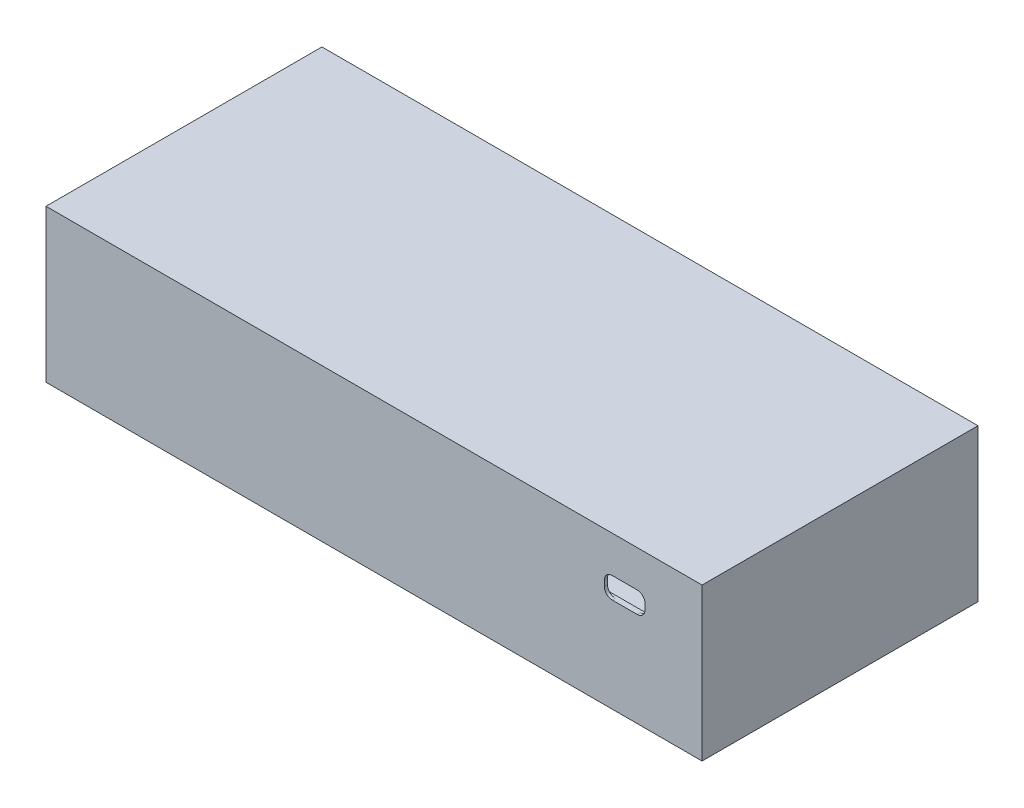
ISO-10303-21;
HEADER;
FILE_DESCRIPTION(('STEP AP214'),'2;1');
FILE_NAME('part.step','',(''),(''),'','','');
FILE_SCHEMA(('AUTOMOTIVE_DESIGN { 1 0 10303 214 1 1 1 1 }'));
ENDSEC;
DATA;
#1=APPLICATION_CONTEXT('core data for automotive mechanical design processes');
#2=APPLICATION_PROTOCOL_DEFINITION('international standard','automotive_design',2000,#1);
#3=PRODUCT_CONTEXT('',#1,'mechanical');
#4=PRODUCT('Part','Part','',(#3));
#5=PRODUCT_RELATED_PRODUCT_CATEGORY('part','',(#4));
#6=PRODUCT_DEFINITION_FORMATION('','',#4);
#7=PRODUCT_DEFINITION_CONTEXT('part definition',#1,'design');
#8=PRODUCT_DEFINITION('design','',#6,#7);
#9=PRODUCT_DEFINITION_SHAPE('','',#8);
#10=(LENGTH_UNIT() NAMED_UNIT(*) SI_UNIT(.MILLI.,.METRE.));
#11=(NAMED_UNIT(*) PLANE_ANGLE_UNIT() SI_UNIT($,.RADIAN.));
#12=(NAMED_UNIT(*) SI_UNIT($,.STERADIAN.) SOLID_ANGLE_UNIT());
#13=UNCERTAINTY_MEASURE_WITH_UNIT(LENGTH_MEASURE(1.E-05),#10,'distance_accuracy_value','');
#14=(GEOMETRIC_REPRESENTATION_CONTEXT(3) GLOBAL_UNCERTAINTY_ASSIGNED_CONTEXT((#13)) GLOBAL_UNIT_ASSIGNED_CONTEXT((#10,
#11,#12)) REPRESENTATION_CONTEXT('',''));
#15=CARTESIAN_POINT('',(0.,0.,0.));
#16=DIRECTION('',(0.,0.,1.));
#17=DIRECTION('',(1.,0.,0.));
#18=AXIS2_PLACEMENT_3D('',#15,#16,#17);
#19=CARTESIAN_POINT('',(25.,39.5,34.25));
#20=DIRECTION('',(0.,0.,1.));
#21=DIRECTION('',(1.,0.,0.));
#22=AXIS2_PLACEMENT_3D('',#19,#20,#21);
#23=PLANE('',#22);
#24=DIRECTION('',(0.,-1.,0.));
#25=VECTOR('',#24,1.);
#26=CARTESIAN_POINT('',(23.2,39.5,34.25));
#27=LINE('',#26,#25);
#28=CARTESIAN_POINT('',(23.2,37.,34.25));
#29=VERTEX_POINT('',#28);
#30=CARTESIAN_POINT('',(23.2,30.5,34.25));
#31=VERTEX_POINT('',#30);
#32=EDGE_CURVE('E236',#29,#31,#27,.T.);
#33=ORIENTED_EDGE('',*,*,#32,.T.);
#34=DIRECTION('',(-1.,0.,0.));
#35=VECTOR('',#34,1.);
#36=CARTESIAN_POINT('',(25.,30.5,34.25));
#37=LINE('',#36,#35);
#38=CARTESIAN_POINT('',(-145.,30.5,34.25));
#39=VERTEX_POINT('',#38);
#40=EDGE_CURVE('E55',#31,#39,#37,.T.);
#41=ORIENTED_EDGE('',*,*,#40,.T.);
#42=DIRECTION('',(0.,-1.,0.));
#43=VECTOR('',#42,1.);
#44=CARTESIAN_POINT('',(-145.,39.5,34.25));
#45=LINE('',#44,#43);
#46=CARTESIAN_POINT('',(-145.,37.,34.25));
#47=VERTEX_POINT('',#46);
#48=EDGE_CURVE('E253',#47,#39,#45,.T.);
#49=ORIENTED_EDGE('',*,*,#48,.F.);
#50=DIRECTION('',(1.,0.,0.));
#51=VECTOR('',#50,1.);
#52=CARTESIAN_POINT('',(-213.545605256646,37.,34.25));
#53=LINE('',#52,#51);
#54=EDGE_CURVE('E212',#47,#29,#53,.T.);
#55=ORIENTED_EDGE('',*,*,#54,.T.);
#56=EDGE_LOOP('',(#33,#41,#49,#55));
#57=FACE_BOUND('',#56,.T.);
#58=ADVANCED_FACE('F39',(#57),#23,.F.);
#59=CARTESIAN_POINT('',(25.,39.5,-34.2499999999999));
#60=DIRECTION('',(0.,0.,-1.));
#61=DIRECTION('',(-1.,0.,0.));
#62=AXIS2_PLACEMENT_3D('',#59,#60,#61);
#63=PLANE('',#62);
#64=DIRECTION('',(1.,0.,0.));
#65=VECTOR('',#64,1.);
#66=CARTESIAN_POINT('',(-213.545605256646,37.,-34.25));
#67=LINE('',#66,#65);
#68=CARTESIAN_POINT('',(-145.,37.,-34.25));
#69=VERTEX_POINT('',#68);
#70=CARTESIAN_POINT('',(23.2,37.,-34.2500000000001));
#71=VERTEX_POINT('',#70);
#72=EDGE_CURVE('E209',#69,#71,#67,.T.);
#73=ORIENTED_EDGE('',*,*,#72,.F.);
#74=DIRECTION('',(0.,-1.,0.));
#75=VECTOR('',#74,1.);
#76=CARTESIAN_POINT('',(-145.,39.5,-34.25));
#77=LINE('',#76,#75);
#78=CARTESIAN_POINT('',(-145.,2.,-34.25));
#79=VERTEX_POINT('',#78);
#80=EDGE_CURVE('E221',#69,#79,#77,.T.);
#81=ORIENTED_EDGE('',*,*,#80,.T.);
#82=DIRECTION('',(1.,0.,0.));
#83=VECTOR('',#82,1.);
#84=CARTESIAN_POINT('',(25.,2.,-34.2499999999999));
#85=LINE('',#84,#83);
#86=CARTESIAN_POINT('',(23.2,2.,-34.25));
#87=VERTEX_POINT('',#86);
#88=EDGE_CURVE('E234',#79,#87,#85,.T.);
#89=ORIENTED_EDGE('',*,*,#88,.T.);
#90=DIRECTION('',(0.,-1.,0.));
#91=VECTOR('',#90,1.);
#92=CARTESIAN_POINT('',(23.2,39.5,-34.25));
#93=LINE('',#92,#91);
#94=EDGE_CURVE('E223',#71,#87,#93,.T.);
#95=ORIENTED_EDGE('',*,*,#94,.F.);
#96=EDGE_LOOP('',(#73,#81,#89,#95));
#97=FACE_BOUND('',#96,.T.);
#98=ADVANCED_FACE('F219',(#97),#63,.F.);
#99=CARTESIAN_POINT('',(23.2,39.5,34.25));
#100=DIRECTION('',(1.,0.,0.));
#101=DIRECTION('',(0.,0.,-1.));
#102=AXIS2_PLACEMENT_3D('',#99,#100,#101);
#103=PLANE('',#102);
#104=DIRECTION('',(0.,0.,1.));
#105=VECTOR('',#104,1.);
#106=CARTESIAN_POINT('',(23.2,37.,-34.2500000000001));
#107=LINE('',#106,#105);
#108=EDGE_CURVE('E224',#71,#29,#107,.T.);
#109=ORIENTED_EDGE('',*,*,#108,.F.);
#110=ORIENTED_EDGE('',*,*,#94,.T.);
#111=DIRECTION('',(0.,0.,1.));
#112=VECTOR('',#111,1.);
#113=CARTESIAN_POINT('',(23.2,2.,34.25));
#114=LINE('',#113,#112);
#115=CARTESIAN_POINT('',(23.2,2.,34.25));
#116=VERTEX_POINT('',#115);
#117=EDGE_CURVE('E416',#87,#116,#114,.T.);
#118=ORIENTED_EDGE('',*,*,#117,.T.);
#119=CARTESIAN_POINT('',(23.2,24.5,34.25));
#120=VERTEX_POINT('',#119);
#121=EDGE_CURVE('E420',#120,#116,#27,.T.);
#122=ORIENTED_EDGE('',*,*,#121,.F.);
#123=DIRECTION('',(0.,0.,-1.));
#124=VECTOR('',#123,1.);
#125=CARTESIAN_POINT('',(23.2,24.5,34.95));
#126=LINE('',#125,#124);
#127=CARTESIAN_POINT('',(23.2,24.5,34.95));
#128=VERTEX_POINT('',#127);
#129=EDGE_CURVE('E417',#128,#120,#126,.T.);
#130=ORIENTED_EDGE('',*,*,#129,.F.);
#131=DIRECTION('',(0.,-1.,0.));
#132=VECTOR('',#131,1.);
#133=CARTESIAN_POINT('',(23.2,30.,34.95));
#134=LINE('',#133,#132);
#135=CARTESIAN_POINT('',(23.2,30.,34.95));
#136=VERTEX_POINT('',#135);
#137=EDGE_CURVE('E451',#136,#128,#134,.T.);
#138=ORIENTED_EDGE('',*,*,#137,.F.);
#139=DIRECTION('',(0.,0.,-1.));
#140=VECTOR('',#139,1.);
#141=CARTESIAN_POINT('',(23.2,30.,34.95));
#142=LINE('',#141,#140);
#143=CARTESIAN_POINT('',(23.2,30.,34.75));
#144=VERTEX_POINT('',#143);
#145=EDGE_CURVE('E372',#136,#144,#142,.T.);
#146=ORIENTED_EDGE('',*,*,#145,.T.);
#147=DIRECTION('',(0.,-0.707106781186548,0.707106781186547));
#148=VECTOR('',#147,1.);
#149=CARTESIAN_POINT('',(23.2,35.,29.75));
#150=LINE('',#149,#148);
#151=EDGE_CURVE('E11',#144,#31,#150,.F.);
#152=ORIENTED_EDGE('',*,*,#151,.T.);
#153=ORIENTED_EDGE('',*,*,#32,.F.);
#154=EDGE_LOOP('',(#109,#110,#118,#122,#130,#138,#146,#152,#153));
#155=FACE_BOUND('',#154,.T.);
#156=ADVANCED_FACE('F387',(#155),#103,.F.);
#157=CARTESIAN_POINT('',(-25.,2.,35.75));
#158=DIRECTION('',(0.,0.,-1.));
#159=DIRECTION('',(-1.,0.,0.));
#160=AXIS2_PLACEMENT_3D('',#157,#158,#159);
#161=PLANE('',#160);
#162=DIRECTION('',(1.,0.,0.));
#163=VECTOR('',#162,1.);
#164=CARTESIAN_POINT('',(-25.,0.,35.75));
#165=LINE('',#164,#163);
#166=CARTESIAN_POINT('',(-145.,0.,35.75));
#167=VERTEX_POINT('',#166);
#168=CARTESIAN_POINT('',(25.,0.,35.75));
#169=VERTEX_POINT('',#168);
#170=EDGE_CURVE('E298',#167,#169,#165,.T.);
#171=ORIENTED_EDGE('',*,*,#170,.T.);
#172=DIRECTION('',(0.,-1.,0.));
#173=VECTOR('',#172,1.);
#174=CARTESIAN_POINT('',(25.,2.,35.75));
#175=LINE('',#174,#173);
#176=CARTESIAN_POINT('',(25.,39.5,35.75));
#177=VERTEX_POINT('',#176);
#178=EDGE_CURVE('E300',#177,#169,#175,.T.);
#179=ORIENTED_EDGE('',*,*,#178,.F.);
#180=DIRECTION('',(1.,0.,0.));
#181=VECTOR('',#180,1.);
#182=CARTESIAN_POINT('',(25.,39.5,35.75));
#183=LINE('',#182,#181);
#184=CARTESIAN_POINT('',(-145.,39.5,35.75));
#185=VERTEX_POINT('',#184);
#186=EDGE_CURVE('E247',#185,#177,#183,.T.);
#187=ORIENTED_EDGE('',*,*,#186,.F.);
#188=DIRECTION('',(0.,-1.,0.));
#189=VECTOR('',#188,1.);
#190=CARTESIAN_POINT('',(-145.,2.,35.75));
#191=LINE('',#190,#189);
#192=EDGE_CURVE('E257',#185,#167,#191,.T.);
#193=ORIENTED_EDGE('',*,*,#192,.T.);
#194=EDGE_LOOP('',(#171,#179,#187,#193));
#195=FACE_BOUND('',#194,.T.);
#196=DIRECTION('',(0.,1.,0.));
#197=VECTOR('',#196,1.);
#198=CARTESIAN_POINT('',(10.2,2.,35.75));
#199=LINE('',#198,#197);
#200=CARTESIAN_POINT('',(10.2,26.5,35.75));
#201=VERTEX_POINT('',#200);
#202=CARTESIAN_POINT('',(10.2,28.,35.75));
#203=VERTEX_POINT('',#202);
#204=EDGE_CURVE('E445',#201,#203,#199,.T.);
#205=ORIENTED_EDGE('',*,*,#204,.F.);
#206=CARTESIAN_POINT('',(8.20000000000001,26.5,35.75));
#207=DIRECTION('',(0.,0.,-1.));
#208=DIRECTION('',(-1.,0.,0.));
#209=AXIS2_PLACEMENT_3D('',#206,#207,#208);
#210=CIRCLE('',#209,2.);
#211=CARTESIAN_POINT('',(8.20000000000001,24.5,35.75));
#212=VERTEX_POINT('',#211);
#213=EDGE_CURVE('E341',#201,#212,#210,.T.);
#214=ORIENTED_EDGE('',*,*,#213,.T.);
#215=DIRECTION('',(-1.,0.,0.));
#216=VECTOR('',#215,1.);
#217=CARTESIAN_POINT('',(-25.,24.5,35.75));
#218=LINE('',#217,#216);
#219=CARTESIAN_POINT('',(1.70000000000001,24.5,35.75));
#220=VERTEX_POINT('',#219);
#221=EDGE_CURVE('E436',#212,#220,#218,.T.);
#222=ORIENTED_EDGE('',*,*,#221,.T.);
#223=CARTESIAN_POINT('',(1.70000000000001,26.5,35.75));
#224=DIRECTION('',(0.,0.,-1.));
#225=DIRECTION('',(-1.,0.,0.));
#226=AXIS2_PLACEMENT_3D('',#223,#224,#225);
#227=CIRCLE('',#226,2.);
#228=CARTESIAN_POINT('',(-0.299999999999991,26.5,35.75));
#229=VERTEX_POINT('',#228);
#230=EDGE_CURVE('E355',#220,#229,#227,.T.);
#231=ORIENTED_EDGE('',*,*,#230,.T.);
#232=DIRECTION('',(0.,1.,0.));
#233=VECTOR('',#232,1.);
#234=CARTESIAN_POINT('',(-0.299999999999991,2.,35.75));
#235=LINE('',#234,#233);
#236=CARTESIAN_POINT('',(-0.299999999999991,28.,35.75));
#237=VERTEX_POINT('',#236);
#238=EDGE_CURVE('E439',#229,#237,#235,.T.);
#239=ORIENTED_EDGE('',*,*,#238,.T.);
#240=CARTESIAN_POINT('',(1.70000000000001,28.,35.75));
#241=DIRECTION('',(0.,0.,-1.));
#242=DIRECTION('',(-1.,0.,0.));
#243=AXIS2_PLACEMENT_3D('',#240,#241,#242);
#244=CIRCLE('',#243,2.);
#245=CARTESIAN_POINT('',(1.70000000000001,30.,35.75));
#246=VERTEX_POINT('',#245);
#247=EDGE_CURVE('E350',#237,#246,#244,.T.);
#248=ORIENTED_EDGE('',*,*,#247,.T.);
#249=DIRECTION('',(1.,0.,0.));
#250=VECTOR('',#249,1.);
#251=CARTESIAN_POINT('',(-25.,30.,35.75));
#252=LINE('',#251,#250);
#253=CARTESIAN_POINT('',(8.20000000000001,30.,35.75));
#254=VERTEX_POINT('',#253);
#255=EDGE_CURVE('E442',#246,#254,#252,.T.);
#256=ORIENTED_EDGE('',*,*,#255,.T.);
#257=CARTESIAN_POINT('',(8.20000000000001,28.,35.75));
#258=DIRECTION('',(0.,0.,-1.));
#259=DIRECTION('',(-1.,0.,0.));
#260=AXIS2_PLACEMENT_3D('',#257,#258,#259);
#261=CIRCLE('',#260,2.);
#262=EDGE_CURVE('E346',#254,#203,#261,.T.);
#263=ORIENTED_EDGE('',*,*,#262,.T.);
#264=EDGE_LOOP('',(#205,#214,#222,#231,#239,#248,#256,#263));
#265=FACE_BOUND('',#264,.T.);
#266=ADVANCED_FACE('F402',(#195,#265),#161,.F.);
#267=CARTESIAN_POINT('',(0.,0.,34.95));
#268=DIRECTION('',(0.,0.,1.));
#269=DIRECTION('',(1.,0.,0.));
#270=AXIS2_PLACEMENT_3D('',#267,#268,#269);
#271=PLANE('',#270);
#272=DIRECTION('',(-1.,0.,0.));
#273=VECTOR('',#272,1.);
#274=CARTESIAN_POINT('',(-145.,24.5000000000001,34.95));
#275=LINE('',#274,#273);
#276=CARTESIAN_POINT('',(8.19999999999996,24.5,34.95));
#277=VERTEX_POINT('',#276);
#278=EDGE_CURVE('E373',#128,#277,#275,.T.);
#279=ORIENTED_EDGE('',*,*,#278,.T.);
#280=CARTESIAN_POINT('',(8.20000000000001,26.5,34.95));
#281=DIRECTION('',(0.,0.,1.));
#282=DIRECTION('',(1.,0.,0.));
#283=AXIS2_PLACEMENT_3D('',#280,#281,#282);
#284=CIRCLE('',#283,2.);
#285=CARTESIAN_POINT('',(10.2,26.5,34.95));
#286=VERTEX_POINT('',#285);
#287=EDGE_CURVE('E339',#277,#286,#284,.T.);
#288=ORIENTED_EDGE('',*,*,#287,.T.);
#289=DIRECTION('',(0.,1.,0.));
#290=VECTOR('',#289,1.);
#291=CARTESIAN_POINT('',(10.2,0.,34.95));
#292=LINE('',#291,#290);
#293=CARTESIAN_POINT('',(10.2,28.,34.95));
#294=VERTEX_POINT('',#293);
#295=EDGE_CURVE('E215',#286,#294,#292,.T.);
#296=ORIENTED_EDGE('',*,*,#295,.T.);
#297=CARTESIAN_POINT('',(8.20000000000001,28.,34.95));
#298=DIRECTION('',(0.,0.,1.));
#299=DIRECTION('',(1.,0.,0.));
#300=AXIS2_PLACEMENT_3D('',#297,#298,#299);
#301=CIRCLE('',#300,2.);
#302=CARTESIAN_POINT('',(8.20000000000001,30.,34.95));
#303=VERTEX_POINT('',#302);
#304=EDGE_CURVE('E343',#294,#303,#301,.T.);
#305=ORIENTED_EDGE('',*,*,#304,.T.);
#306=DIRECTION('',(1.,0.,0.));
#307=VECTOR('',#306,1.);
#308=CARTESIAN_POINT('',(23.2,30.,34.95));
#309=LINE('',#308,#307);
#310=EDGE_CURVE('E449',#303,#136,#309,.T.);
#311=ORIENTED_EDGE('',*,*,#310,.T.);
#312=ORIENTED_EDGE('',*,*,#137,.T.);
#313=EDGE_LOOP('',(#279,#288,#296,#305,#311,#312));
#314=FACE_BOUND('',#313,.T.);
#315=ADVANCED_FACE('F393',(#314),#271,.F.);
#316=CARTESIAN_POINT('',(-145.,24.5000000000001,34.25));
#317=VERTEX_POINT('',#316);
#318=CARTESIAN_POINT('',(-145.,2.,34.25));
#319=VERTEX_POINT('',#318);
#320=EDGE_CURVE('E250',#317,#319,#45,.T.);
#321=ORIENTED_EDGE('',*,*,#320,.F.);
#322=DIRECTION('',(-1.,0.,0.));
#323=VECTOR('',#322,1.);
#324=CARTESIAN_POINT('',(-145.,24.5000000000001,34.25));
#325=LINE('',#324,#323);
#326=EDGE_CURVE('E408',#120,#317,#325,.T.);
#327=ORIENTED_EDGE('',*,*,#326,.F.);
#328=ORIENTED_EDGE('',*,*,#121,.T.);
#329=DIRECTION('',(-1.,0.,0.));
#330=VECTOR('',#329,1.);
#331=CARTESIAN_POINT('',(25.,2.,34.25));
#332=LINE('',#331,#330);
#333=EDGE_CURVE('E240',#116,#319,#332,.T.);
#334=ORIENTED_EDGE('',*,*,#333,.T.);
#335=EDGE_LOOP('',(#321,#327,#328,#334));
#336=FACE_BOUND('',#335,.T.);
#337=ADVANCED_FACE('F383',(#336),#23,.F.);
#338=CARTESIAN_POINT('',(0.,2.,0.));
#339=DIRECTION('',(0.,-1.,0.));
#340=DIRECTION('',(0.,0.,-1.));
#341=AXIS2_PLACEMENT_3D('',#338,#339,#340);
#342=PLANE('',#341);
#343=CARTESIAN_POINT('',(-13.9,2.,0.));
#344=DIRECTION('',(0.,1.,0.));
#345=DIRECTION('',(0.,0.,1.));
#346=AXIS2_PLACEMENT_3D('',#343,#344,#345);
#347=CIRCLE('',#346,1.25);
#348=CARTESIAN_POINT('',(-13.9,2.,1.24999999999999));
#349=VERTEX_POINT('',#348);
#350=EDGE_CURVE('E266',#349,#349,#347,.T.);
#351=ORIENTED_EDGE('',*,*,#350,.F.);
#352=EDGE_LOOP('',(#351));
#353=FACE_BOUND('',#352,.T.);
#354=CARTESIAN_POINT('',(13.9,2.,0.));
#355=DIRECTION('',(0.,1.,0.));
#356=DIRECTION('',(0.,0.,1.));
#357=AXIS2_PLACEMENT_3D('',#354,#355,#356);
#358=CIRCLE('',#357,1.25);
#359=CARTESIAN_POINT('',(13.9,2.,1.24999999999999));
#360=VERTEX_POINT('',#359);
#361=EDGE_CURVE('E263',#360,#360,#358,.F.);
#362=ORIENTED_EDGE('',*,*,#361,.T.);
#363=EDGE_LOOP('',(#362));
#364=FACE_BOUND('',#363,.T.);
#365=DIRECTION('',(-1.,0.,0.));
#366=VECTOR('',#365,1.);
#367=CARTESIAN_POINT('',(-11.5,2.,-6.25));
#368=LINE('',#367,#366);
#369=CARTESIAN_POINT('',(11.5,2.,-6.25));
#370=VERTEX_POINT('',#369);
#371=CARTESIAN_POINT('',(-11.5,2.,-6.25));
#372=VERTEX_POINT('',#371);
#373=EDGE_CURVE('E274',#370,#372,#368,.T.);
#374=ORIENTED_EDGE('',*,*,#373,.F.);
#375=DIRECTION('',(0.,0.,-1.));
#376=VECTOR('',#375,1.);
#377=CARTESIAN_POINT('',(11.5,2.,6.25));
#378=LINE('',#377,#376);
#379=CARTESIAN_POINT('',(11.5,2.,6.25));
#380=VERTEX_POINT('',#379);
#381=EDGE_CURVE('E272',#380,#370,#378,.T.);
#382=ORIENTED_EDGE('',*,*,#381,.F.);
#383=DIRECTION('',(1.,0.,0.));
#384=VECTOR('',#383,1.);
#385=CARTESIAN_POINT('',(-11.5,2.,6.25));
#386=LINE('',#385,#384);
#387=CARTESIAN_POINT('',(-11.5,2.,6.25));
#388=VERTEX_POINT('',#387);
#389=EDGE_CURVE('E281',#388,#380,#386,.T.);
#390=ORIENTED_EDGE('',*,*,#389,.F.);
#391=DIRECTION('',(0.,0.,1.));
#392=VECTOR('',#391,1.);
#393=CARTESIAN_POINT('',(-11.5,2.,6.25));
#394=LINE('',#393,#392);
#395=EDGE_CURVE('E278',#372,#388,#394,.T.);
#396=ORIENTED_EDGE('',*,*,#395,.F.);
#397=EDGE_LOOP('',(#374,#382,#390,#396));
#398=FACE_BOUND('',#397,.T.);
#399=ORIENTED_EDGE('',*,*,#117,.F.);
#400=ORIENTED_EDGE('',*,*,#88,.F.);
#401=DIRECTION('',(0.,0.,-1.));
#402=VECTOR('',#401,1.);
#403=CARTESIAN_POINT('',(-145.,2.,35.75));
#404=LINE('',#403,#402);
#405=EDGE_CURVE('E230',#319,#79,#404,.T.);
#406=ORIENTED_EDGE('',*,*,#405,.F.);
#407=ORIENTED_EDGE('',*,*,#333,.F.);
#408=EDGE_LOOP('',(#399,#400,#406,#407));
#409=FACE_BOUND('',#408,.T.);
#410=ADVANCED_FACE('F392',(#353,#364,#398,#409),#342,.F.);
#411=CARTESIAN_POINT('',(0.,0.,0.));
#412=DIRECTION('',(0.,-1.,0.));
#413=DIRECTION('',(0.,0.,-1.));
#414=AXIS2_PLACEMENT_3D('',#411,#412,#413);
#415=PLANE('',#414);
#416=CARTESIAN_POINT('',(13.9,0.,0.));
#417=DIRECTION('',(0.,-1.,0.));
#418=DIRECTION('',(0.,0.,-1.));
#419=AXIS2_PLACEMENT_3D('',#416,#417,#418);
#420=CIRCLE('',#419,1.25);
#421=CARTESIAN_POINT('',(13.9,0.,-1.25));
#422=VERTEX_POINT('',#421);
#423=EDGE_CURVE('E269',#422,#422,#420,.F.);
#424=ORIENTED_EDGE('',*,*,#423,.T.);
#425=EDGE_LOOP('',(#424));
#426=FACE_BOUND('',#425,.T.);
#427=DIRECTION('',(0.,0.,1.));
#428=VECTOR('',#427,1.);
#429=CARTESIAN_POINT('',(11.5,0.,0.));
#430=LINE('',#429,#428);
#431=CARTESIAN_POINT('',(11.5,0.,-6.25));
#432=VERTEX_POINT('',#431);
#433=CARTESIAN_POINT('',(11.5,0.,6.25));
#434=VERTEX_POINT('',#433);
#435=EDGE_CURVE('E313',#432,#434,#430,.T.);
#436=ORIENTED_EDGE('',*,*,#435,.F.);
#437=DIRECTION('',(1.,0.,0.));
#438=VECTOR('',#437,1.);
#439=CARTESIAN_POINT('',(0.,0.,-6.25));
#440=LINE('',#439,#438);
#441=CARTESIAN_POINT('',(-11.5,0.,-6.25));
#442=VERTEX_POINT('',#441);
#443=EDGE_CURVE('E306',#442,#432,#440,.T.);
#444=ORIENTED_EDGE('',*,*,#443,.F.);
#445=DIRECTION('',(0.,0.,-1.));
#446=VECTOR('',#445,1.);
#447=CARTESIAN_POINT('',(-11.5,0.,0.));
#448=LINE('',#447,#446);
#449=CARTESIAN_POINT('',(-11.5,0.,6.25));
#450=VERTEX_POINT('',#449);
#451=EDGE_CURVE('E308',#450,#442,#448,.T.);
#452=ORIENTED_EDGE('',*,*,#451,.F.);
#453=DIRECTION('',(-1.,0.,0.));
#454=VECTOR('',#453,1.);
#455=CARTESIAN_POINT('',(0.,0.,6.25));
#456=LINE('',#455,#454);
#457=EDGE_CURVE('E311',#434,#450,#456,.T.);
#458=ORIENTED_EDGE('',*,*,#457,.F.);
#459=EDGE_LOOP('',(#436,#444,#452,#458));
#460=FACE_BOUND('',#459,.T.);
#461=DIRECTION('',(0.,0.,-1.));
#462=VECTOR('',#461,1.);
#463=CARTESIAN_POINT('',(25.,0.,35.75));
#464=LINE('',#463,#462);
#465=CARTESIAN_POINT('',(25.,0.,-35.75));
#466=VERTEX_POINT('',#465);
#467=EDGE_CURVE('E287',#169,#466,#464,.T.);
#468=ORIENTED_EDGE('',*,*,#467,.F.);
#469=ORIENTED_EDGE('',*,*,#170,.F.);
#470=DIRECTION('',(0.,0.,-1.));
#471=VECTOR('',#470,1.);
#472=CARTESIAN_POINT('',(-145.,0.,35.75));
#473=LINE('',#472,#471);
#474=CARTESIAN_POINT('',(-145.,0.,-35.75));
#475=VERTEX_POINT('',#474);
#476=EDGE_CURVE('E255',#167,#475,#473,.T.);
#477=ORIENTED_EDGE('',*,*,#476,.T.);
#478=DIRECTION('',(-1.,0.,0.));
#479=VECTOR('',#478,1.);
#480=CARTESIAN_POINT('',(-25.,0.,-35.75));
#481=LINE('',#480,#479);
#482=EDGE_CURVE('E296',#466,#475,#481,.T.);
#483=ORIENTED_EDGE('',*,*,#482,.F.);
#484=EDGE_LOOP('',(#468,#469,#477,#483));
#485=FACE_BOUND('',#484,.T.);
#486=CARTESIAN_POINT('',(-13.9,0.,0.));
#487=DIRECTION('',(0.,-1.,0.));
#488=DIRECTION('',(0.,0.,-1.));
#489=AXIS2_PLACEMENT_3D('',#486,#487,#488);
#490=CIRCLE('',#489,1.25);
#491=CARTESIAN_POINT('',(-13.9,0.,-1.25));
#492=VERTEX_POINT('',#491);
#493=EDGE_CURVE('E275',#492,#492,#490,.T.);
#494=ORIENTED_EDGE('',*,*,#493,.F.);
#495=EDGE_LOOP('',(#494));
#496=FACE_BOUND('',#495,.T.);
#497=ADVANCED_FACE('F399',(#426,#460,#485,#496),#415,.T.);
#498=CARTESIAN_POINT('',(25.,2.,35.75));
#499=DIRECTION('',(-1.,0.,0.));
#500=DIRECTION('',(0.,0.,1.));
#501=AXIS2_PLACEMENT_3D('',#498,#499,#500);
#502=PLANE('',#501);
#503=ORIENTED_EDGE('',*,*,#467,.T.);
#504=DIRECTION('',(0.,-1.,0.));
#505=VECTOR('',#504,1.);
#506=CARTESIAN_POINT('',(25.,2.,-35.75));
#507=LINE('',#506,#505);
#508=CARTESIAN_POINT('',(25.,39.5,-35.7499999999999));
#509=VERTEX_POINT('',#508);
#510=EDGE_CURVE('E303',#509,#466,#507,.T.);
#511=ORIENTED_EDGE('',*,*,#510,.F.);
#512=DIRECTION('',(0.,0.,-1.));
#513=VECTOR('',#512,1.);
#514=CARTESIAN_POINT('',(25.,39.5,35.75));
#515=LINE('',#514,#513);
#516=EDGE_CURVE('E242',#177,#509,#515,.T.);
#517=ORIENTED_EDGE('',*,*,#516,.F.);
#518=ORIENTED_EDGE('',*,*,#178,.T.);
#519=EDGE_LOOP('',(#503,#511,#517,#518));
#520=FACE_BOUND('',#519,.T.);
#521=ADVANCED_FACE('F499',(#520),#502,.F.);
#522=CARTESIAN_POINT('',(-25.,2.,-35.75));
#523=DIRECTION('',(0.,0.,1.));
#524=DIRECTION('',(1.,0.,0.));
#525=AXIS2_PLACEMENT_3D('',#522,#523,#524);
#526=PLANE('',#525);
#527=ORIENTED_EDGE('',*,*,#482,.T.);
#528=DIRECTION('',(0.,-1.,0.));
#529=VECTOR('',#528,1.);
#530=CARTESIAN_POINT('',(-145.,2.,-35.75));
#531=LINE('',#530,#529);
#532=CARTESIAN_POINT('',(-145.,39.5,-35.75));
#533=VERTEX_POINT('',#532);
#534=EDGE_CURVE('E260',#533,#475,#531,.T.);
#535=ORIENTED_EDGE('',*,*,#534,.F.);
#536=DIRECTION('',(-1.,0.,0.));
#537=VECTOR('',#536,1.);
#538=CARTESIAN_POINT('',(25.,39.5,-35.7499999999999));
#539=LINE('',#538,#537);
#540=EDGE_CURVE('E231',#509,#533,#539,.T.);
#541=ORIENTED_EDGE('',*,*,#540,.F.);
#542=ORIENTED_EDGE('',*,*,#510,.T.);
#543=EDGE_LOOP('',(#527,#535,#541,#542));
#544=FACE_BOUND('',#543,.T.);
#545=ADVANCED_FACE('F661',(#544),#526,.F.);
#546=CARTESIAN_POINT('',(11.5,-1.,6.25));
#547=DIRECTION('',(1.,0.,0.));
#548=DIRECTION('',(0.,0.,-1.));
#549=AXIS2_PLACEMENT_3D('',#546,#547,#548);
#550=PLANE('',#549);
#551=ORIENTED_EDGE('',*,*,#435,.T.);
#552=DIRECTION('',(0.,1.,0.));
#553=VECTOR('',#552,1.);
#554=CARTESIAN_POINT('',(11.5,-1.,6.25));
#555=LINE('',#554,#553);
#556=EDGE_CURVE('E285',#434,#380,#555,.T.);
#557=ORIENTED_EDGE('',*,*,#556,.T.);
#558=ORIENTED_EDGE('',*,*,#381,.T.);
#559=DIRECTION('',(0.,1.,0.));
#560=VECTOR('',#559,1.);
#561=CARTESIAN_POINT('',(11.5,-1.,-6.25));
#562=LINE('',#561,#560);
#563=EDGE_CURVE('E284',#432,#370,#562,.T.);
#564=ORIENTED_EDGE('',*,*,#563,.F.);
#565=EDGE_LOOP('',(#551,#557,#558,#564));
#566=FACE_BOUND('',#565,.T.);
#567=ADVANCED_FACE('F680',(#566),#550,.F.);
#568=CARTESIAN_POINT('',(-11.5,-1.,6.25));
#569=DIRECTION('',(0.,0.,1.));
#570=DIRECTION('',(1.,0.,0.));
#571=AXIS2_PLACEMENT_3D('',#568,#569,#570);
#572=PLANE('',#571);
#573=ORIENTED_EDGE('',*,*,#457,.T.);
#574=DIRECTION('',(0.,1.,0.));
#575=VECTOR('',#574,1.);
#576=CARTESIAN_POINT('',(-11.5,-1.,6.25));
#577=LINE('',#576,#575);
#578=EDGE_CURVE('E288',#450,#388,#577,.T.);
#579=ORIENTED_EDGE('',*,*,#578,.T.);
#580=ORIENTED_EDGE('',*,*,#389,.T.);
#581=ORIENTED_EDGE('',*,*,#556,.F.);
#582=EDGE_LOOP('',(#573,#579,#580,#581));
#583=FACE_BOUND('',#582,.T.);
#584=ADVANCED_FACE('F734',(#583),#572,.F.);
#585=CARTESIAN_POINT('',(-11.5,-1.,6.25));
#586=DIRECTION('',(-1.,0.,0.));
#587=DIRECTION('',(0.,0.,1.));
#588=AXIS2_PLACEMENT_3D('',#585,#586,#587);
#589=PLANE('',#588);
#590=ORIENTED_EDGE('',*,*,#451,.T.);
#591=DIRECTION('',(0.,1.,0.));
#592=VECTOR('',#591,1.);
#593=CARTESIAN_POINT('',(-11.5,-1.,-6.25));
#594=LINE('',#593,#592);
#595=EDGE_CURVE('E290',#442,#372,#594,.T.);
#596=ORIENTED_EDGE('',*,*,#595,.T.);
#597=ORIENTED_EDGE('',*,*,#395,.T.);
#598=ORIENTED_EDGE('',*,*,#578,.F.);
#599=EDGE_LOOP('',(#590,#596,#597,#598));
#600=FACE_BOUND('',#599,.T.);
#601=ADVANCED_FACE('F722',(#600),#589,.F.);
#602=CARTESIAN_POINT('',(-11.5,-1.,-6.25));
#603=DIRECTION('',(0.,0.,-1.));
#604=DIRECTION('',(-1.,0.,0.));
#605=AXIS2_PLACEMENT_3D('',#602,#603,#604);
#606=PLANE('',#605);
#607=ORIENTED_EDGE('',*,*,#443,.T.);
#608=ORIENTED_EDGE('',*,*,#563,.T.);
#609=ORIENTED_EDGE('',*,*,#373,.T.);
#610=ORIENTED_EDGE('',*,*,#595,.F.);
#611=EDGE_LOOP('',(#607,#608,#609,#610));
#612=FACE_BOUND('',#611,.T.);
#613=ADVANCED_FACE('F711',(#612),#606,.F.);
#614=CARTESIAN_POINT('',(13.9,-1.,0.));
#615=DIRECTION('',(0.,1.,0.));
#616=DIRECTION('',(0.,0.,1.));
#617=AXIS2_PLACEMENT_3D('',#614,#615,#616);
#618=CYLINDRICAL_SURFACE('',#617,1.25);
#619=ORIENTED_EDGE('',*,*,#423,.F.);
#620=EDGE_LOOP('',(#619));
#621=FACE_BOUND('',#620,.T.);
#622=ORIENTED_EDGE('',*,*,#361,.F.);
#623=EDGE_LOOP('',(#622));
#624=FACE_BOUND('',#623,.T.);
#625=ADVANCED_FACE('F700',(#621,#624),#618,.F.);
#626=CARTESIAN_POINT('',(-13.9,-1.,0.));
#627=DIRECTION('',(0.,1.,0.));
#628=DIRECTION('',(0.,0.,1.));
#629=AXIS2_PLACEMENT_3D('',#626,#627,#628);
#630=CYLINDRICAL_SURFACE('',#629,1.25);
#631=ORIENTED_EDGE('',*,*,#493,.T.);
#632=EDGE_LOOP('',(#631));
#633=FACE_BOUND('',#632,.T.);
#634=ORIENTED_EDGE('',*,*,#350,.T.);
#635=EDGE_LOOP('',(#634));
#636=FACE_BOUND('',#635,.T.);
#637=ADVANCED_FACE('F546',(#633,#636),#630,.F.);
#638=CARTESIAN_POINT('',(-145.,2.,35.75));
#639=DIRECTION('',(-1.,0.,0.));
#640=DIRECTION('',(0.,0.,1.));
#641=AXIS2_PLACEMENT_3D('',#638,#639,#640);
#642=PLANE('',#641);
#643=ORIENTED_EDGE('',*,*,#48,.T.);
#644=DIRECTION('',(0.,0.707106781186548,-0.707106781186547));
#645=VECTOR('',#644,1.);
#646=CARTESIAN_POINT('',(-145.,15.5,49.25));
#647=LINE('',#646,#645);
#648=CARTESIAN_POINT('',(-145.,30.,34.75));
#649=VERTEX_POINT('',#648);
#650=EDGE_CURVE('E48',#39,#649,#647,.F.);
#651=ORIENTED_EDGE('',*,*,#650,.T.);
#652=DIRECTION('',(0.,0.,-1.));
#653=VECTOR('',#652,1.);
#654=CARTESIAN_POINT('',(-145.,30.,34.95));
#655=LINE('',#654,#653);
#656=CARTESIAN_POINT('',(-145.,30.,34.95));
#657=VERTEX_POINT('',#656);
#658=EDGE_CURVE('E364',#657,#649,#655,.T.);
#659=ORIENTED_EDGE('',*,*,#658,.F.);
#660=DIRECTION('',(0.,1.,0.));
#661=VECTOR('',#660,1.);
#662=CARTESIAN_POINT('',(-145.,30.,34.95));
#663=LINE('',#662,#661);
#664=CARTESIAN_POINT('',(-145.,24.5000000000001,34.95));
#665=VERTEX_POINT('',#664);
#666=EDGE_CURVE('E414',#665,#657,#663,.T.);
#667=ORIENTED_EDGE('',*,*,#666,.F.);
#668=DIRECTION('',(0.,0.,-1.));
#669=VECTOR('',#668,1.);
#670=CARTESIAN_POINT('',(-145.,24.5000000000001,34.95));
#671=LINE('',#670,#669);
#672=EDGE_CURVE('E413',#665,#317,#671,.T.);
#673=ORIENTED_EDGE('',*,*,#672,.T.);
#674=ORIENTED_EDGE('',*,*,#320,.T.);
#675=ORIENTED_EDGE('',*,*,#405,.T.);
#676=ORIENTED_EDGE('',*,*,#80,.F.);
#677=DIRECTION('',(0.,0.,1.));
#678=VECTOR('',#677,1.);
#679=CARTESIAN_POINT('',(-145.,37.,-34.25));
#680=LINE('',#679,#678);
#681=EDGE_CURVE('E206',#69,#47,#680,.T.);
#682=ORIENTED_EDGE('',*,*,#681,.T.);
#683=EDGE_LOOP('',(#643,#651,#659,#667,#673,#674,#675,#676,#682));
#684=FACE_BOUND('',#683,.T.);
#685=DIRECTION('',(0.,0.,1.));
#686=VECTOR('',#685,1.);
#687=CARTESIAN_POINT('',(-145.,39.5,35.75));
#688=LINE('',#687,#686);
#689=EDGE_CURVE('E244',#533,#185,#688,.T.);
#690=ORIENTED_EDGE('',*,*,#689,.F.);
#691=ORIENTED_EDGE('',*,*,#534,.T.);
#692=ORIENTED_EDGE('',*,*,#476,.F.);
#693=ORIENTED_EDGE('',*,*,#192,.F.);
#694=EDGE_LOOP('',(#690,#691,#692,#693));
#695=FACE_BOUND('',#694,.T.);
#696=ADVANCED_FACE('F227',(#684,#695),#642,.T.);
#697=CARTESIAN_POINT('',(0.,39.5,0.));
#698=DIRECTION('',(0.,1.,0.));
#699=DIRECTION('',(0.,0.,1.));
#700=AXIS2_PLACEMENT_3D('',#697,#698,#699);
#701=PLANE('',#700);
#702=ORIENTED_EDGE('',*,*,#540,.T.);
#703=ORIENTED_EDGE('',*,*,#689,.T.);
#704=ORIENTED_EDGE('',*,*,#186,.T.);
#705=ORIENTED_EDGE('',*,*,#516,.T.);
#706=EDGE_LOOP('',(#702,#703,#704,#705));
#707=FACE_BOUND('',#706,.T.);
#708=ADVANCED_FACE('F521',(#707),#701,.T.);
#709=CARTESIAN_POINT('',(-145.,24.5000000000001,34.95));
#710=DIRECTION('',(0.,-1.,0.));
#711=DIRECTION('',(1.,0.,0.));
#712=AXIS2_PLACEMENT_3D('',#709,#710,#711);
#713=PLANE('',#712);
#714=ORIENTED_EDGE('',*,*,#221,.F.);
#715=DIRECTION('',(0.,0.,-1.));
#716=VECTOR('',#715,1.);
#717=CARTESIAN_POINT('',(8.20000000000001,24.5,34.95));
#718=LINE('',#717,#716);
#719=EDGE_CURVE('E321',#212,#277,#718,.T.);
#720=ORIENTED_EDGE('',*,*,#719,.T.);
#721=ORIENTED_EDGE('',*,*,#278,.F.);
#722=ORIENTED_EDGE('',*,*,#129,.T.);
#723=ORIENTED_EDGE('',*,*,#326,.T.);
#724=ORIENTED_EDGE('',*,*,#672,.F.);
#725=CARTESIAN_POINT('',(1.70000000000001,24.5,34.95));
#726=VERTEX_POINT('',#725);
#727=EDGE_CURVE('E453',#726,#665,#275,.T.);
#728=ORIENTED_EDGE('',*,*,#727,.F.);
#729=DIRECTION('',(0.,0.,-1.));
#730=VECTOR('',#729,1.);
#731=CARTESIAN_POINT('',(1.70000000000001,24.5,35.75));
#732=LINE('',#731,#730);
#733=EDGE_CURVE('E315',#726,#220,#732,.F.);
#734=ORIENTED_EDGE('',*,*,#733,.T.);
#735=EDGE_LOOP('',(#714,#720,#721,#722,#723,#724,#728,#734));
#736=FACE_BOUND('',#735,.T.);
#737=ADVANCED_FACE('F460',(#736),#713,.F.);
#738=CARTESIAN_POINT('',(23.2,30.,34.95));
#739=DIRECTION('',(0.,1.,0.));
#740=DIRECTION('',(-1.,0.,0.));
#741=AXIS2_PLACEMENT_3D('',#738,#739,#740);
#742=PLANE('',#741);
#743=ORIENTED_EDGE('',*,*,#658,.T.);
#744=DIRECTION('',(1.,0.,0.));
#745=VECTOR('',#744,1.);
#746=CARTESIAN_POINT('',(23.2,30.,34.75));
#747=LINE('',#746,#745);
#748=EDGE_CURVE('E357',#649,#144,#747,.T.);
#749=ORIENTED_EDGE('',*,*,#748,.T.);
#750=ORIENTED_EDGE('',*,*,#145,.F.);
#751=ORIENTED_EDGE('',*,*,#310,.F.);
#752=DIRECTION('',(0.,0.,-1.));
#753=VECTOR('',#752,1.);
#754=CARTESIAN_POINT('',(8.20000000000001,30.,34.95));
#755=LINE('',#754,#753);
#756=EDGE_CURVE('E332',#303,#254,#755,.F.);
#757=ORIENTED_EDGE('',*,*,#756,.T.);
#758=ORIENTED_EDGE('',*,*,#255,.F.);
#759=DIRECTION('',(0.,0.,-1.));
#760=VECTOR('',#759,1.);
#761=CARTESIAN_POINT('',(1.70000000000001,30.,34.95));
#762=LINE('',#761,#760);
#763=CARTESIAN_POINT('',(1.70000000000002,30.,34.95));
#764=VERTEX_POINT('',#763);
#765=EDGE_CURVE('E329',#246,#764,#762,.T.);
#766=ORIENTED_EDGE('',*,*,#765,.T.);
#767=EDGE_CURVE('E370',#657,#764,#309,.T.);
#768=ORIENTED_EDGE('',*,*,#767,.F.);
#769=EDGE_LOOP('',(#743,#749,#750,#751,#757,#758,#766,#768));
#770=FACE_BOUND('',#769,.T.);
#771=ADVANCED_FACE('F368',(#770),#742,.F.);
#772=ORIENTED_EDGE('',*,*,#767,.T.);
#773=CARTESIAN_POINT('',(1.70000000000001,28.,34.95));
#774=DIRECTION('',(0.,0.,1.));
#775=DIRECTION('',(1.,0.,0.));
#776=AXIS2_PLACEMENT_3D('',#773,#774,#775);
#777=CIRCLE('',#776,2.);
#778=CARTESIAN_POINT('',(-0.29999999999999,28.,34.95));
#779=VERTEX_POINT('',#778);
#780=EDGE_CURVE('E348',#764,#779,#777,.T.);
#781=ORIENTED_EDGE('',*,*,#780,.T.);
#782=DIRECTION('',(0.,1.,0.));
#783=VECTOR('',#782,1.);
#784=CARTESIAN_POINT('',(-0.29999999999999,0.,34.95));
#785=LINE('',#784,#783);
#786=CARTESIAN_POINT('',(-0.29999999999999,26.5,34.95));
#787=VERTEX_POINT('',#786);
#788=EDGE_CURVE('E433',#787,#779,#785,.T.);
#789=ORIENTED_EDGE('',*,*,#788,.F.);
#790=CARTESIAN_POINT('',(1.70000000000001,26.5,34.95));
#791=DIRECTION('',(0.,0.,1.));
#792=DIRECTION('',(1.,0.,0.));
#793=AXIS2_PLACEMENT_3D('',#790,#791,#792);
#794=CIRCLE('',#793,2.);
#795=EDGE_CURVE('E352',#787,#726,#794,.T.);
#796=ORIENTED_EDGE('',*,*,#795,.T.);
#797=ORIENTED_EDGE('',*,*,#727,.T.);
#798=ORIENTED_EDGE('',*,*,#666,.T.);
#799=EDGE_LOOP('',(#772,#781,#789,#796,#797,#798));
#800=FACE_BOUND('',#799,.T.);
#801=ADVANCED_FACE('F405',(#800),#271,.F.);
#802=CARTESIAN_POINT('',(10.2,0.,35.95));
#803=DIRECTION('',(-1.,0.,0.));
#804=DIRECTION('',(0.,0.,1.));
#805=AXIS2_PLACEMENT_3D('',#802,#803,#804);
#806=PLANE('',#805);
#807=ORIENTED_EDGE('',*,*,#295,.F.);
#808=DIRECTION('',(0.,0.,-1.));
#809=VECTOR('',#808,1.);
#810=CARTESIAN_POINT('',(10.2,26.5,35.95));
#811=LINE('',#810,#809);
#812=EDGE_CURVE('E327',#286,#201,#811,.F.);
#813=ORIENTED_EDGE('',*,*,#812,.T.);
#814=ORIENTED_EDGE('',*,*,#204,.T.);
#815=DIRECTION('',(0.,0.,-1.));
#816=VECTOR('',#815,1.);
#817=CARTESIAN_POINT('',(10.2,28.,35.95));
#818=LINE('',#817,#816);
#819=EDGE_CURVE('E324',#203,#294,#818,.T.);
#820=ORIENTED_EDGE('',*,*,#819,.T.);
#821=EDGE_LOOP('',(#807,#813,#814,#820));
#822=FACE_BOUND('',#821,.T.);
#823=ADVANCED_FACE('F485',(#822),#806,.T.);
#824=CARTESIAN_POINT('',(-0.29999999999999,0.,35.95));
#825=DIRECTION('',(-1.,0.,0.));
#826=DIRECTION('',(0.,0.,1.));
#827=AXIS2_PLACEMENT_3D('',#824,#825,#826);
#828=PLANE('',#827);
#829=ORIENTED_EDGE('',*,*,#788,.T.);
#830=DIRECTION('',(0.,0.,-1.));
#831=VECTOR('',#830,1.);
#832=CARTESIAN_POINT('',(-0.29999999999999,28.,35.75));
#833=LINE('',#832,#831);
#834=EDGE_CURVE('E337',#779,#237,#833,.F.);
#835=ORIENTED_EDGE('',*,*,#834,.T.);
#836=ORIENTED_EDGE('',*,*,#238,.F.);
#837=DIRECTION('',(0.,0.,-1.));
#838=VECTOR('',#837,1.);
#839=CARTESIAN_POINT('',(-0.29999999999999,26.5,34.95));
#840=LINE('',#839,#838);
#841=EDGE_CURVE('E334',#229,#787,#840,.T.);
#842=ORIENTED_EDGE('',*,*,#841,.T.);
#843=EDGE_LOOP('',(#829,#835,#836,#842));
#844=FACE_BOUND('',#843,.T.);
#845=ADVANCED_FACE('F470',(#844),#828,.F.);
#846=CARTESIAN_POINT('',(8.20000000000001,26.5,34.95));
#847=DIRECTION('',(0.,0.,-1.));
#848=DIRECTION('',(-1.,0.,0.));
#849=AXIS2_PLACEMENT_3D('',#846,#847,#848);
#850=CYLINDRICAL_SURFACE('',#849,2.);
#851=ORIENTED_EDGE('',*,*,#213,.F.);
#852=ORIENTED_EDGE('',*,*,#812,.F.);
#853=ORIENTED_EDGE('',*,*,#287,.F.);
#854=ORIENTED_EDGE('',*,*,#719,.F.);
#855=EDGE_LOOP('',(#851,#852,#853,#854));
#856=FACE_BOUND('',#855,.T.);
#857=ADVANCED_FACE('F488',(#856),#850,.F.);
#858=CARTESIAN_POINT('',(8.20000000000001,28.,35.95));
#859=DIRECTION('',(0.,0.,-1.));
#860=DIRECTION('',(-1.,0.,0.));
#861=AXIS2_PLACEMENT_3D('',#858,#859,#860);
#862=CYLINDRICAL_SURFACE('',#861,2.);
#863=ORIENTED_EDGE('',*,*,#262,.F.);
#864=ORIENTED_EDGE('',*,*,#756,.F.);
#865=ORIENTED_EDGE('',*,*,#304,.F.);
#866=ORIENTED_EDGE('',*,*,#819,.F.);
#867=EDGE_LOOP('',(#863,#864,#865,#866));
#868=FACE_BOUND('',#867,.T.);
#869=ADVANCED_FACE('F482',(#868),#862,.F.);
#870=CARTESIAN_POINT('',(1.70000000000001,28.,34.95));
#871=DIRECTION('',(0.,0.,1.));
#872=DIRECTION('',(1.,0.,0.));
#873=AXIS2_PLACEMENT_3D('',#870,#871,#872);
#874=CYLINDRICAL_SURFACE('',#873,2.);
#875=ORIENTED_EDGE('',*,*,#247,.F.);
#876=ORIENTED_EDGE('',*,*,#834,.F.);
#877=ORIENTED_EDGE('',*,*,#780,.F.);
#878=ORIENTED_EDGE('',*,*,#765,.F.);
#879=EDGE_LOOP('',(#875,#876,#877,#878));
#880=FACE_BOUND('',#879,.T.);
#881=ADVANCED_FACE('F476',(#880),#874,.F.);
#882=CARTESIAN_POINT('',(1.70000000000001,26.5,35.95));
#883=DIRECTION('',(0.,0.,1.));
#884=DIRECTION('',(1.,0.,0.));
#885=AXIS2_PLACEMENT_3D('',#882,#883,#884);
#886=CYLINDRICAL_SURFACE('',#885,2.);
#887=ORIENTED_EDGE('',*,*,#230,.F.);
#888=ORIENTED_EDGE('',*,*,#733,.F.);
#889=ORIENTED_EDGE('',*,*,#795,.F.);
#890=ORIENTED_EDGE('',*,*,#841,.F.);
#891=EDGE_LOOP('',(#887,#888,#889,#890));
#892=FACE_BOUND('',#891,.T.);
#893=ADVANCED_FACE('F379',(#892),#886,.F.);
#894=CARTESIAN_POINT('',(-213.545605256646,37.,-34.25));
#895=DIRECTION('',(0.,1.,0.));
#896=DIRECTION('',(0.,0.,1.));
#897=AXIS2_PLACEMENT_3D('',#894,#895,#896);
#898=PLANE('',#897);
#899=ORIENTED_EDGE('',*,*,#681,.F.);
#900=ORIENTED_EDGE('',*,*,#72,.T.);
#901=ORIENTED_EDGE('',*,*,#108,.T.);
#902=ORIENTED_EDGE('',*,*,#54,.F.);
#903=EDGE_LOOP('',(#899,#900,#901,#902));
#904=FACE_BOUND('',#903,.T.);
#905=ADVANCED_FACE('F208',(#904),#898,.F.);
#906=CARTESIAN_POINT('',(23.2,30.,34.75));
#907=DIRECTION('',(0.,0.707106781186547,0.707106781186548));
#908=DIRECTION('',(1.,0.,0.));
#909=AXIS2_PLACEMENT_3D('',#906,#907,#908);
#910=PLANE('',#909);
#911=ORIENTED_EDGE('',*,*,#650,.F.);
#912=ORIENTED_EDGE('',*,*,#40,.F.);
#913=ORIENTED_EDGE('',*,*,#151,.F.);
#914=ORIENTED_EDGE('',*,*,#748,.F.);
#915=EDGE_LOOP('',(#911,#912,#913,#914));
#916=FACE_BOUND('',#915,.T.);
#917=ADVANCED_FACE('F42',(#916),#910,.F.);
#918=CLOSED_SHELL('',(#58,#98,#156,#266,#315,#337,#410,#497,#521,#545,#567,#584,#601,#613,#625,
#637,#696,#708,#737,#771,#801,#823,#845,#857,#869,#881,#893,#905,#917));
#919=MANIFOLD_SOLID_BREP('B2',#918);
#920=ADVANCED_BREP_SHAPE_REPRESENTATION('',(#18,#919),#14);
#921=SHAPE_DEFINITION_REPRESENTATION(#9,#920);
ENDSEC;
END-ISO-10303-21;
